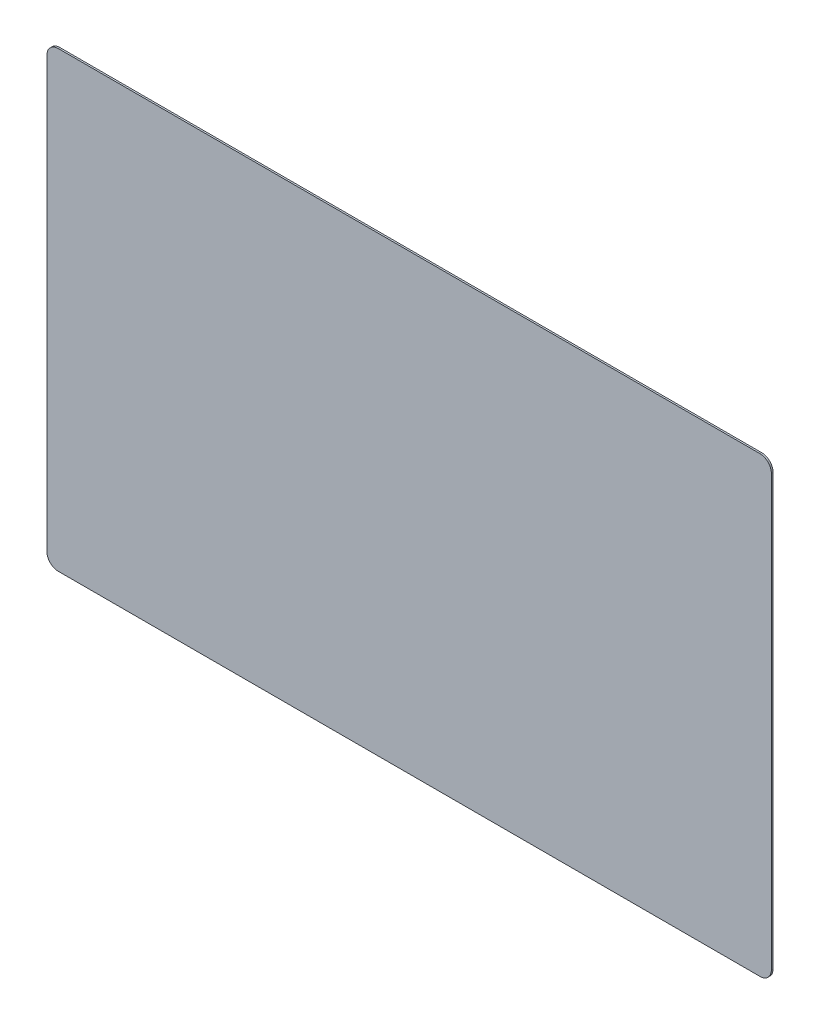
ISO-10303-21;
HEADER;
FILE_DESCRIPTION(('STEP AP214'),'2;1');
FILE_NAME('part.step','',(''),(''),'','','');
FILE_SCHEMA(('AUTOMOTIVE_DESIGN { 1 0 10303 214 1 1 1 1 }'));
ENDSEC;
DATA;
#1=APPLICATION_CONTEXT('core data for automotive mechanical design processes');
#2=APPLICATION_PROTOCOL_DEFINITION('international standard','automotive_design',2000,#1);
#3=PRODUCT_CONTEXT('',#1,'mechanical');
#4=PRODUCT('Part','Part','',(#3));
#5=PRODUCT_RELATED_PRODUCT_CATEGORY('part','',(#4));
#6=PRODUCT_DEFINITION_FORMATION('','',#4);
#7=PRODUCT_DEFINITION_CONTEXT('part definition',#1,'design');
#8=PRODUCT_DEFINITION('design','',#6,#7);
#9=PRODUCT_DEFINITION_SHAPE('','',#8);
#10=(LENGTH_UNIT() NAMED_UNIT(*) SI_UNIT(.MILLI.,.METRE.));
#11=(NAMED_UNIT(*) PLANE_ANGLE_UNIT() SI_UNIT($,.RADIAN.));
#12=(NAMED_UNIT(*) SI_UNIT($,.STERADIAN.) SOLID_ANGLE_UNIT());
#13=UNCERTAINTY_MEASURE_WITH_UNIT(LENGTH_MEASURE(1.E-05),#10,'distance_accuracy_value','');
#14=(GEOMETRIC_REPRESENTATION_CONTEXT(3) GLOBAL_UNCERTAINTY_ASSIGNED_CONTEXT((#13)) GLOBAL_UNIT_ASSIGNED_CONTEXT((#10,
#11,#12)) REPRESENTATION_CONTEXT('',''));
#15=CARTESIAN_POINT('',(0.,0.,0.));
#16=DIRECTION('',(0.,0.,1.));
#17=DIRECTION('',(1.,0.,0.));
#18=AXIS2_PLACEMENT_3D('',#15,#16,#17);
#19=CARTESIAN_POINT('',(-320.,-200.,-1.5));
#20=DIRECTION('',(-1.,0.,0.));
#21=DIRECTION('',(0.,0.,1.));
#22=AXIS2_PLACEMENT_3D('',#19,#20,#21);
#23=PLANE('',#22);
#24=DIRECTION('',(0.,-1.,0.));
#25=VECTOR('',#24,1.);
#26=CARTESIAN_POINT('',(-320.,-200.,0.));
#27=LINE('',#26,#25);
#28=CARTESIAN_POINT('',(-320.,190.,0.));
#29=VERTEX_POINT('',#28);
#30=CARTESIAN_POINT('',(-320.,-190.,0.));
#31=VERTEX_POINT('',#30);
#32=EDGE_CURVE('E111',#29,#31,#27,.T.);
#33=ORIENTED_EDGE('',*,*,#32,.F.);
#34=DIRECTION('',(0.,0.,1.));
#35=VECTOR('',#34,1.);
#36=CARTESIAN_POINT('',(-320.,190.,-1.5));
#37=LINE('',#36,#35);
#38=CARTESIAN_POINT('',(-320.,190.,-1.5));
#39=VERTEX_POINT('',#38);
#40=EDGE_CURVE('E11',#29,#39,#37,.F.);
#41=ORIENTED_EDGE('',*,*,#40,.T.);
#42=DIRECTION('',(0.,-1.,0.));
#43=VECTOR('',#42,1.);
#44=CARTESIAN_POINT('',(-320.,-200.,-1.5));
#45=LINE('',#44,#43);
#46=CARTESIAN_POINT('',(-320.,-190.,-1.5));
#47=VERTEX_POINT('',#46);
#48=EDGE_CURVE('E161',#39,#47,#45,.T.);
#49=ORIENTED_EDGE('',*,*,#48,.T.);
#50=DIRECTION('',(0.,0.,1.));
#51=VECTOR('',#50,1.);
#52=CARTESIAN_POINT('',(-320.,-190.,-1.5));
#53=LINE('',#52,#51);
#54=EDGE_CURVE('E48',#47,#31,#53,.T.);
#55=ORIENTED_EDGE('',*,*,#54,.T.);
#56=EDGE_LOOP('',(#33,#41,#49,#55));
#57=FACE_BOUND('',#56,.T.);
#58=ADVANCED_FACE('F40',(#57),#23,.T.);
#59=CARTESIAN_POINT('',(320.,200.,-1.5));
#60=DIRECTION('',(0.,1.,0.));
#61=DIRECTION('',(-1.,0.,0.));
#62=AXIS2_PLACEMENT_3D('',#59,#60,#61);
#63=PLANE('',#62);
#64=DIRECTION('',(-1.,0.,0.));
#65=VECTOR('',#64,1.);
#66=CARTESIAN_POINT('',(320.,200.,0.));
#67=LINE('',#66,#65);
#68=CARTESIAN_POINT('',(310.,200.,0.));
#69=VERTEX_POINT('',#68);
#70=CARTESIAN_POINT('',(-310.,200.,0.));
#71=VERTEX_POINT('',#70);
#72=EDGE_CURVE('E136',#69,#71,#67,.T.);
#73=ORIENTED_EDGE('',*,*,#72,.F.);
#74=DIRECTION('',(0.,0.,1.));
#75=VECTOR('',#74,1.);
#76=CARTESIAN_POINT('',(310.,200.,-1.5));
#77=LINE('',#76,#75);
#78=CARTESIAN_POINT('',(310.,200.,-1.5));
#79=VERTEX_POINT('',#78);
#80=EDGE_CURVE('E62',#69,#79,#77,.F.);
#81=ORIENTED_EDGE('',*,*,#80,.T.);
#82=DIRECTION('',(-1.,0.,0.));
#83=VECTOR('',#82,1.);
#84=CARTESIAN_POINT('',(320.,200.,-1.5));
#85=LINE('',#84,#83);
#86=CARTESIAN_POINT('',(-310.,200.,-1.5));
#87=VERTEX_POINT('',#86);
#88=EDGE_CURVE('E130',#79,#87,#85,.T.);
#89=ORIENTED_EDGE('',*,*,#88,.T.);
#90=DIRECTION('',(0.,0.,1.));
#91=VECTOR('',#90,1.);
#92=CARTESIAN_POINT('',(-310.,200.,-1.5));
#93=LINE('',#92,#91);
#94=EDGE_CURVE('E155',#87,#71,#93,.T.);
#95=ORIENTED_EDGE('',*,*,#94,.T.);
#96=EDGE_LOOP('',(#73,#81,#89,#95));
#97=FACE_BOUND('',#96,.T.);
#98=ADVANCED_FACE('F193',(#97),#63,.T.);
#99=CARTESIAN_POINT('',(320.,-200.,-1.5));
#100=DIRECTION('',(1.,0.,0.));
#101=DIRECTION('',(0.,0.,-1.));
#102=AXIS2_PLACEMENT_3D('',#99,#100,#101);
#103=PLANE('',#102);
#104=DIRECTION('',(0.,1.,0.));
#105=VECTOR('',#104,1.);
#106=CARTESIAN_POINT('',(320.,-200.,0.));
#107=LINE('',#106,#105);
#108=CARTESIAN_POINT('',(320.,-190.,0.));
#109=VERTEX_POINT('',#108);
#110=CARTESIAN_POINT('',(320.,190.,0.));
#111=VERTEX_POINT('',#110);
#112=EDGE_CURVE('E126',#109,#111,#107,.T.);
#113=ORIENTED_EDGE('',*,*,#112,.F.);
#114=DIRECTION('',(0.,0.,1.));
#115=VECTOR('',#114,1.);
#116=CARTESIAN_POINT('',(320.,-190.,-1.5));
#117=LINE('',#116,#115);
#118=CARTESIAN_POINT('',(320.,-190.,-1.5));
#119=VERTEX_POINT('',#118);
#120=EDGE_CURVE('E147',#109,#119,#117,.F.);
#121=ORIENTED_EDGE('',*,*,#120,.T.);
#122=DIRECTION('',(0.,1.,0.));
#123=VECTOR('',#122,1.);
#124=CARTESIAN_POINT('',(320.,-200.,-1.5));
#125=LINE('',#124,#123);
#126=CARTESIAN_POINT('',(320.,190.,-1.5));
#127=VERTEX_POINT('',#126);
#128=EDGE_CURVE('E133',#119,#127,#125,.T.);
#129=ORIENTED_EDGE('',*,*,#128,.T.);
#130=DIRECTION('',(0.,0.,1.));
#131=VECTOR('',#130,1.);
#132=CARTESIAN_POINT('',(320.,190.,-1.5));
#133=LINE('',#132,#131);
#134=EDGE_CURVE('E144',#127,#111,#133,.T.);
#135=ORIENTED_EDGE('',*,*,#134,.T.);
#136=EDGE_LOOP('',(#113,#121,#129,#135));
#137=FACE_BOUND('',#136,.T.);
#138=ADVANCED_FACE('F173',(#137),#103,.T.);
#139=CARTESIAN_POINT('',(320.,-200.,-1.5));
#140=DIRECTION('',(0.,-1.,0.));
#141=DIRECTION('',(1.,0.,0.));
#142=AXIS2_PLACEMENT_3D('',#139,#140,#141);
#143=PLANE('',#142);
#144=DIRECTION('',(1.,0.,0.));
#145=VECTOR('',#144,1.);
#146=CARTESIAN_POINT('',(320.,-200.,-1.5));
#147=LINE('',#146,#145);
#148=CARTESIAN_POINT('',(-310.,-200.,-1.5));
#149=VERTEX_POINT('',#148);
#150=CARTESIAN_POINT('',(310.,-200.,-1.5));
#151=VERTEX_POINT('',#150);
#152=EDGE_CURVE('E162',#149,#151,#147,.T.);
#153=ORIENTED_EDGE('',*,*,#152,.T.);
#154=DIRECTION('',(0.,0.,1.));
#155=VECTOR('',#154,1.);
#156=CARTESIAN_POINT('',(310.,-200.,-1.5));
#157=LINE('',#156,#155);
#158=CARTESIAN_POINT('',(310.,-200.,0.));
#159=VERTEX_POINT('',#158);
#160=EDGE_CURVE('E117',#151,#159,#157,.T.);
#161=ORIENTED_EDGE('',*,*,#160,.T.);
#162=DIRECTION('',(1.,0.,0.));
#163=VECTOR('',#162,1.);
#164=CARTESIAN_POINT('',(320.,-200.,0.));
#165=LINE('',#164,#163);
#166=CARTESIAN_POINT('',(-310.,-200.,0.));
#167=VERTEX_POINT('',#166);
#168=EDGE_CURVE('E109',#167,#159,#165,.T.);
#169=ORIENTED_EDGE('',*,*,#168,.F.);
#170=DIRECTION('',(0.,0.,1.));
#171=VECTOR('',#170,1.);
#172=CARTESIAN_POINT('',(-310.,-200.,-1.5));
#173=LINE('',#172,#171);
#174=EDGE_CURVE('E123',#167,#149,#173,.F.);
#175=ORIENTED_EDGE('',*,*,#174,.T.);
#176=EDGE_LOOP('',(#153,#161,#169,#175));
#177=FACE_BOUND('',#176,.T.);
#178=ADVANCED_FACE('F122',(#177),#143,.T.);
#179=CARTESIAN_POINT('',(0.,0.,-1.5));
#180=DIRECTION('',(0.,0.,1.));
#181=DIRECTION('',(1.,0.,0.));
#182=AXIS2_PLACEMENT_3D('',#179,#180,#181);
#183=PLANE('',#182);
#184=ORIENTED_EDGE('',*,*,#128,.F.);
#185=CARTESIAN_POINT('',(310.,-190.,-1.5));
#186=DIRECTION('',(0.,0.,1.));
#187=DIRECTION('',(1.,0.,0.));
#188=AXIS2_PLACEMENT_3D('',#185,#186,#187);
#189=CIRCLE('',#188,10.);
#190=EDGE_CURVE('E153',#119,#151,#189,.F.);
#191=ORIENTED_EDGE('',*,*,#190,.T.);
#192=ORIENTED_EDGE('',*,*,#152,.F.);
#193=CARTESIAN_POINT('',(-310.,-190.,-1.5));
#194=DIRECTION('',(0.,0.,1.));
#195=DIRECTION('',(1.,0.,0.));
#196=AXIS2_PLACEMENT_3D('',#193,#194,#195);
#197=CIRCLE('',#196,10.);
#198=EDGE_CURVE('E129',#149,#47,#197,.F.);
#199=ORIENTED_EDGE('',*,*,#198,.T.);
#200=ORIENTED_EDGE('',*,*,#48,.F.);
#201=CARTESIAN_POINT('',(-310.,190.,-1.5));
#202=DIRECTION('',(0.,0.,1.));
#203=DIRECTION('',(1.,0.,0.));
#204=AXIS2_PLACEMENT_3D('',#201,#202,#203);
#205=CIRCLE('',#204,10.);
#206=EDGE_CURVE('E55',#39,#87,#205,.F.);
#207=ORIENTED_EDGE('',*,*,#206,.T.);
#208=ORIENTED_EDGE('',*,*,#88,.F.);
#209=CARTESIAN_POINT('',(310.,190.,-1.5));
#210=DIRECTION('',(0.,0.,1.));
#211=DIRECTION('',(1.,0.,0.));
#212=AXIS2_PLACEMENT_3D('',#209,#210,#211);
#213=CIRCLE('',#212,10.);
#214=EDGE_CURVE('E151',#79,#127,#213,.F.);
#215=ORIENTED_EDGE('',*,*,#214,.T.);
#216=EDGE_LOOP('',(#184,#191,#192,#199,#200,#207,#208,#215));
#217=FACE_BOUND('',#216,.T.);
#218=ADVANCED_FACE('F179',(#217),#183,.F.);
#219=CARTESIAN_POINT('',(0.,0.,0.));
#220=DIRECTION('',(0.,0.,1.));
#221=DIRECTION('',(1.,0.,0.));
#222=AXIS2_PLACEMENT_3D('',#219,#220,#221);
#223=PLANE('',#222);
#224=ORIENTED_EDGE('',*,*,#168,.T.);
#225=CARTESIAN_POINT('',(310.,-190.,0.));
#226=DIRECTION('',(0.,0.,1.));
#227=DIRECTION('',(1.,0.,0.));
#228=AXIS2_PLACEMENT_3D('',#225,#226,#227);
#229=CIRCLE('',#228,10.);
#230=EDGE_CURVE('E142',#159,#109,#229,.T.);
#231=ORIENTED_EDGE('',*,*,#230,.T.);
#232=ORIENTED_EDGE('',*,*,#112,.T.);
#233=CARTESIAN_POINT('',(310.,190.,0.));
#234=DIRECTION('',(0.,0.,1.));
#235=DIRECTION('',(1.,0.,0.));
#236=AXIS2_PLACEMENT_3D('',#233,#234,#235);
#237=CIRCLE('',#236,10.);
#238=EDGE_CURVE('E140',#111,#69,#237,.T.);
#239=ORIENTED_EDGE('',*,*,#238,.T.);
#240=ORIENTED_EDGE('',*,*,#72,.T.);
#241=CARTESIAN_POINT('',(-310.,190.,0.));
#242=DIRECTION('',(0.,0.,1.));
#243=DIRECTION('',(1.,0.,0.));
#244=AXIS2_PLACEMENT_3D('',#241,#242,#243);
#245=CIRCLE('',#244,10.);
#246=EDGE_CURVE('E116',#71,#29,#245,.T.);
#247=ORIENTED_EDGE('',*,*,#246,.T.);
#248=ORIENTED_EDGE('',*,*,#32,.T.);
#249=CARTESIAN_POINT('',(-310.,-190.,0.));
#250=DIRECTION('',(0.,0.,1.));
#251=DIRECTION('',(1.,0.,0.));
#252=AXIS2_PLACEMENT_3D('',#249,#250,#251);
#253=CIRCLE('',#252,10.);
#254=EDGE_CURVE('E106',#31,#167,#253,.T.);
#255=ORIENTED_EDGE('',*,*,#254,.T.);
#256=EDGE_LOOP('',(#224,#231,#232,#239,#240,#247,#248,#255));
#257=FACE_BOUND('',#256,.T.);
#258=ADVANCED_FACE('F108',(#257),#223,.T.);
#259=CARTESIAN_POINT('',(310.,-190.,-1.5));
#260=DIRECTION('',(0.,0.,1.));
#261=DIRECTION('',(1.,0.,0.));
#262=AXIS2_PLACEMENT_3D('',#259,#260,#261);
#263=CYLINDRICAL_SURFACE('',#262,10.);
#264=ORIENTED_EDGE('',*,*,#190,.F.);
#265=ORIENTED_EDGE('',*,*,#120,.F.);
#266=ORIENTED_EDGE('',*,*,#230,.F.);
#267=ORIENTED_EDGE('',*,*,#160,.F.);
#268=EDGE_LOOP('',(#264,#265,#266,#267));
#269=FACE_BOUND('',#268,.T.);
#270=ADVANCED_FACE('F178',(#269),#263,.T.);
#271=CARTESIAN_POINT('',(310.,190.,-1.5));
#272=DIRECTION('',(0.,0.,1.));
#273=DIRECTION('',(1.,0.,0.));
#274=AXIS2_PLACEMENT_3D('',#271,#272,#273);
#275=CYLINDRICAL_SURFACE('',#274,10.);
#276=ORIENTED_EDGE('',*,*,#214,.F.);
#277=ORIENTED_EDGE('',*,*,#80,.F.);
#278=ORIENTED_EDGE('',*,*,#238,.F.);
#279=ORIENTED_EDGE('',*,*,#134,.F.);
#280=EDGE_LOOP('',(#276,#277,#278,#279));
#281=FACE_BOUND('',#280,.T.);
#282=ADVANCED_FACE('F182',(#281),#275,.T.);
#283=CARTESIAN_POINT('',(-310.,190.,-1.5));
#284=DIRECTION('',(0.,0.,1.));
#285=DIRECTION('',(1.,0.,0.));
#286=AXIS2_PLACEMENT_3D('',#283,#284,#285);
#287=CYLINDRICAL_SURFACE('',#286,10.);
#288=ORIENTED_EDGE('',*,*,#206,.F.);
#289=ORIENTED_EDGE('',*,*,#40,.F.);
#290=ORIENTED_EDGE('',*,*,#246,.F.);
#291=ORIENTED_EDGE('',*,*,#94,.F.);
#292=EDGE_LOOP('',(#288,#289,#290,#291));
#293=FACE_BOUND('',#292,.T.);
#294=ADVANCED_FACE('F184',(#293),#287,.T.);
#295=CARTESIAN_POINT('',(-310.,-190.,-1.5));
#296=DIRECTION('',(0.,0.,1.));
#297=DIRECTION('',(1.,0.,0.));
#298=AXIS2_PLACEMENT_3D('',#295,#296,#297);
#299=CYLINDRICAL_SURFACE('',#298,10.);
#300=ORIENTED_EDGE('',*,*,#198,.F.);
#301=ORIENTED_EDGE('',*,*,#174,.F.);
#302=ORIENTED_EDGE('',*,*,#254,.F.);
#303=ORIENTED_EDGE('',*,*,#54,.F.);
#304=EDGE_LOOP('',(#300,#301,#302,#303));
#305=FACE_BOUND('',#304,.T.);
#306=ADVANCED_FACE('F42',(#305),#299,.T.);
#307=CLOSED_SHELL('',(#58,#98,#138,#178,#218,#258,#270,#282,#294,#306));
#308=MANIFOLD_SOLID_BREP('B2',#307);
#309=ADVANCED_BREP_SHAPE_REPRESENTATION('',(#18,#308),#14);
#310=SHAPE_DEFINITION_REPRESENTATION(#9,#309);
ENDSEC;
END-ISO-10303-21;
